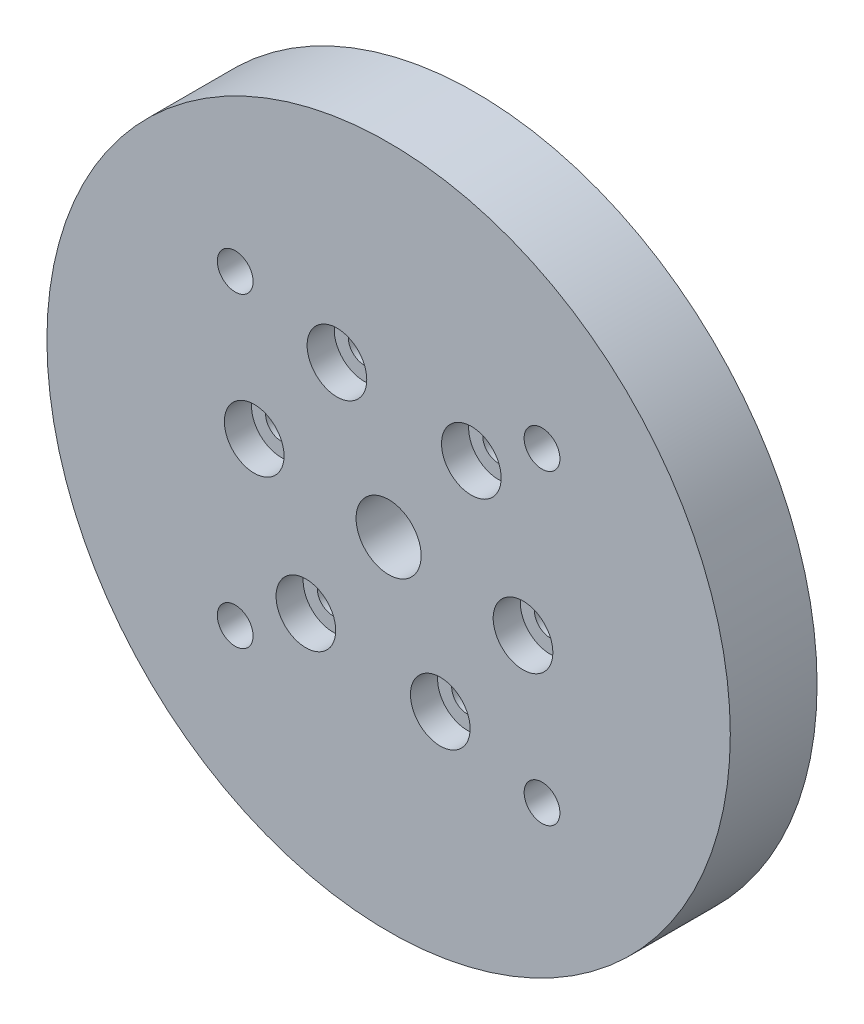
ISO-10303-21;
HEADER;
FILE_DESCRIPTION(('STEP AP214'),'2;1');
FILE_NAME('part.step','',(''),(''),'','','');
FILE_SCHEMA(('AUTOMOTIVE_DESIGN { 1 0 10303 214 1 1 1 1 }'));
ENDSEC;
DATA;
#1=APPLICATION_CONTEXT('core data for automotive mechanical design processes');
#2=APPLICATION_PROTOCOL_DEFINITION('international standard','automotive_design',2000,#1);
#3=PRODUCT_CONTEXT('',#1,'mechanical');
#4=PRODUCT('Part','Part','',(#3));
#5=PRODUCT_RELATED_PRODUCT_CATEGORY('part','',(#4));
#6=PRODUCT_DEFINITION_FORMATION('','',#4);
#7=PRODUCT_DEFINITION_CONTEXT('part definition',#1,'design');
#8=PRODUCT_DEFINITION('design','',#6,#7);
#9=PRODUCT_DEFINITION_SHAPE('','',#8);
#10=(LENGTH_UNIT() NAMED_UNIT(*) SI_UNIT(.MILLI.,.METRE.));
#11=(NAMED_UNIT(*) PLANE_ANGLE_UNIT() SI_UNIT($,.RADIAN.));
#12=(NAMED_UNIT(*) SI_UNIT($,.STERADIAN.) SOLID_ANGLE_UNIT());
#13=UNCERTAINTY_MEASURE_WITH_UNIT(LENGTH_MEASURE(1.E-05),#10,'distance_accuracy_value','');
#14=(GEOMETRIC_REPRESENTATION_CONTEXT(3) GLOBAL_UNCERTAINTY_ASSIGNED_CONTEXT((#13)) GLOBAL_UNIT_ASSIGNED_CONTEXT((#10,
#11,#12)) REPRESENTATION_CONTEXT('',''));
#15=CARTESIAN_POINT('',(0.,0.,0.));
#16=DIRECTION('',(0.,0.,1.));
#17=DIRECTION('',(1.,0.,0.));
#18=AXIS2_PLACEMENT_3D('',#15,#16,#17);
#19=CARTESIAN_POINT('',(7.62681454876585,9.90362054193988,575.));
#20=DIRECTION('',(0.,0.,-1.));
#21=DIRECTION('',(-1.,0.,0.));
#22=AXIS2_PLACEMENT_3D('',#19,#20,#21);
#23=CYLINDRICAL_SURFACE('',#22,1.45);
#24=CARTESIAN_POINT('',(7.62681454876585,9.90362054193988,567.));
#25=DIRECTION('',(0.,0.,1.));
#26=DIRECTION('',(1.,0.,0.));
#27=AXIS2_PLACEMENT_3D('',#24,#25,#26);
#28=CIRCLE('',#27,1.45);
#29=CARTESIAN_POINT('',(9.07681454876585,9.90362054193988,567.));
#30=VERTEX_POINT('',#29);
#31=EDGE_CURVE('E110',#30,#30,#28,.T.);
#32=ORIENTED_EDGE('',*,*,#31,.F.);
#33=EDGE_LOOP('',(#32));
#34=FACE_BOUND('',#33,.T.);
#35=CARTESIAN_POINT('',(7.62681454876585,9.90362054193988,572.5));
#36=DIRECTION('',(0.,0.,1.));
#37=DIRECTION('',(1.,0.,0.));
#38=AXIS2_PLACEMENT_3D('',#35,#36,#37);
#39=CIRCLE('',#38,1.45);
#40=CARTESIAN_POINT('',(9.07681454876585,9.90362054193988,572.5));
#41=VERTEX_POINT('',#40);
#42=EDGE_CURVE('E44',#41,#41,#39,.T.);
#43=ORIENTED_EDGE('',*,*,#42,.T.);
#44=EDGE_LOOP('',(#43));
#45=FACE_BOUND('',#44,.T.);
#46=ADVANCED_FACE('F41',(#34,#45),#23,.F.);
#47=CARTESIAN_POINT('',(-4.76337970437843,11.5568254201539,575.));
#48=DIRECTION('',(0.,0.,-1.));
#49=DIRECTION('',(-1.,0.,0.));
#50=AXIS2_PLACEMENT_3D('',#47,#48,#49);
#51=CYLINDRICAL_SURFACE('',#50,1.45);
#52=CARTESIAN_POINT('',(-4.76337970437843,11.5568254201539,567.));
#53=DIRECTION('',(0.,0.,1.));
#54=DIRECTION('',(1.,0.,0.));
#55=AXIS2_PLACEMENT_3D('',#52,#53,#54);
#56=CIRCLE('',#55,1.45);
#57=CARTESIAN_POINT('',(-3.31337970437843,11.5568254201539,567.));
#58=VERTEX_POINT('',#57);
#59=EDGE_CURVE('E111',#58,#58,#56,.T.);
#60=ORIENTED_EDGE('',*,*,#59,.F.);
#61=EDGE_LOOP('',(#60));
#62=FACE_BOUND('',#61,.T.);
#63=CARTESIAN_POINT('',(-4.76337970437843,11.5568254201539,572.5));
#64=DIRECTION('',(0.,0.,1.));
#65=DIRECTION('',(1.,0.,0.));
#66=AXIS2_PLACEMENT_3D('',#63,#64,#65);
#67=CIRCLE('',#66,1.45);
#68=CARTESIAN_POINT('',(-3.31337970437843,11.5568254201539,572.5));
#69=VERTEX_POINT('',#68);
#70=EDGE_CURVE('E79',#69,#69,#67,.T.);
#71=ORIENTED_EDGE('',*,*,#70,.T.);
#72=EDGE_LOOP('',(#71));
#73=FACE_BOUND('',#72,.T.);
#74=ADVANCED_FACE('F174',(#62,#73),#51,.F.);
#75=CARTESIAN_POINT('',(-12.3901942531443,1.65320487821403,575.));
#76=DIRECTION('',(0.,0.,-1.));
#77=DIRECTION('',(-1.,0.,0.));
#78=AXIS2_PLACEMENT_3D('',#75,#76,#77);
#79=CYLINDRICAL_SURFACE('',#78,1.45);
#80=CARTESIAN_POINT('',(-12.3901942531443,1.65320487821403,567.));
#81=DIRECTION('',(0.,0.,1.));
#82=DIRECTION('',(1.,0.,0.));
#83=AXIS2_PLACEMENT_3D('',#80,#81,#82);
#84=CIRCLE('',#83,1.45);
#85=CARTESIAN_POINT('',(-10.9401942531443,1.65320487821403,567.));
#86=VERTEX_POINT('',#85);
#87=EDGE_CURVE('E103',#86,#86,#84,.T.);
#88=ORIENTED_EDGE('',*,*,#87,.F.);
#89=EDGE_LOOP('',(#88));
#90=FACE_BOUND('',#89,.T.);
#91=CARTESIAN_POINT('',(-12.3901942531443,1.65320487821403,572.5));
#92=DIRECTION('',(0.,0.,1.));
#93=DIRECTION('',(1.,0.,0.));
#94=AXIS2_PLACEMENT_3D('',#91,#92,#93);
#95=CIRCLE('',#94,1.45);
#96=CARTESIAN_POINT('',(-10.9401942531443,1.65320487821403,572.5));
#97=VERTEX_POINT('',#96);
#98=EDGE_CURVE('E77',#97,#97,#95,.T.);
#99=ORIENTED_EDGE('',*,*,#98,.T.);
#100=EDGE_LOOP('',(#99));
#101=FACE_BOUND('',#100,.T.);
#102=ADVANCED_FACE('F179',(#90,#101),#79,.F.);
#103=CARTESIAN_POINT('',(-7.62681454876585,-9.90362054193988,575.));
#104=DIRECTION('',(0.,0.,-1.));
#105=DIRECTION('',(-1.,0.,0.));
#106=AXIS2_PLACEMENT_3D('',#103,#104,#105);
#107=CYLINDRICAL_SURFACE('',#106,1.45);
#108=CARTESIAN_POINT('',(-7.62681454876585,-9.90362054193988,567.));
#109=DIRECTION('',(0.,0.,1.));
#110=DIRECTION('',(1.,0.,0.));
#111=AXIS2_PLACEMENT_3D('',#108,#109,#110);
#112=CIRCLE('',#111,1.45);
#113=CARTESIAN_POINT('',(-6.17681454876585,-9.90362054193988,567.));
#114=VERTEX_POINT('',#113);
#115=EDGE_CURVE('E93',#114,#114,#112,.T.);
#116=ORIENTED_EDGE('',*,*,#115,.F.);
#117=EDGE_LOOP('',(#116));
#118=FACE_BOUND('',#117,.T.);
#119=CARTESIAN_POINT('',(-7.62681454876585,-9.90362054193988,572.5));
#120=DIRECTION('',(0.,0.,1.));
#121=DIRECTION('',(1.,0.,0.));
#122=AXIS2_PLACEMENT_3D('',#119,#120,#121);
#123=CIRCLE('',#122,1.45);
#124=CARTESIAN_POINT('',(-6.17681454876585,-9.90362054193988,572.5));
#125=VERTEX_POINT('',#124);
#126=EDGE_CURVE('E75',#125,#125,#123,.T.);
#127=ORIENTED_EDGE('',*,*,#126,.T.);
#128=EDGE_LOOP('',(#127));
#129=FACE_BOUND('',#128,.T.);
#130=ADVANCED_FACE('F188',(#118,#129),#107,.F.);
#131=CARTESIAN_POINT('',(4.76337970437842,-11.5568254201539,575.));
#132=DIRECTION('',(0.,0.,-1.));
#133=DIRECTION('',(-1.,0.,0.));
#134=AXIS2_PLACEMENT_3D('',#131,#132,#133);
#135=CYLINDRICAL_SURFACE('',#134,1.45);
#136=CARTESIAN_POINT('',(4.76337970437842,-11.5568254201539,567.));
#137=DIRECTION('',(0.,0.,1.));
#138=DIRECTION('',(1.,0.,0.));
#139=AXIS2_PLACEMENT_3D('',#136,#137,#138);
#140=CIRCLE('',#139,1.45);
#141=CARTESIAN_POINT('',(6.21337970437842,-11.5568254201539,567.));
#142=VERTEX_POINT('',#141);
#143=EDGE_CURVE('E87',#142,#142,#140,.T.);
#144=ORIENTED_EDGE('',*,*,#143,.F.);
#145=EDGE_LOOP('',(#144));
#146=FACE_BOUND('',#145,.T.);
#147=CARTESIAN_POINT('',(4.76337970437842,-11.5568254201539,572.5));
#148=DIRECTION('',(0.,0.,1.));
#149=DIRECTION('',(1.,0.,0.));
#150=AXIS2_PLACEMENT_3D('',#147,#148,#149);
#151=CIRCLE('',#150,1.45);
#152=CARTESIAN_POINT('',(6.21337970437842,-11.5568254201539,572.5));
#153=VERTEX_POINT('',#152);
#154=EDGE_CURVE('E69',#153,#153,#151,.T.);
#155=ORIENTED_EDGE('',*,*,#154,.T.);
#156=EDGE_LOOP('',(#155));
#157=FACE_BOUND('',#156,.T.);
#158=ADVANCED_FACE('F184',(#146,#157),#135,.F.);
#159=CARTESIAN_POINT('',(12.3901942531443,-1.65320487821403,575.));
#160=DIRECTION('',(0.,0.,-1.));
#161=DIRECTION('',(-1.,0.,0.));
#162=AXIS2_PLACEMENT_3D('',#159,#160,#161);
#163=CYLINDRICAL_SURFACE('',#162,1.45);
#164=CARTESIAN_POINT('',(12.3901942531443,-1.65320487821403,567.));
#165=DIRECTION('',(0.,0.,1.));
#166=DIRECTION('',(1.,0.,0.));
#167=AXIS2_PLACEMENT_3D('',#164,#165,#166);
#168=CIRCLE('',#167,1.45);
#169=CARTESIAN_POINT('',(13.8401942531443,-1.65320487821403,567.));
#170=VERTEX_POINT('',#169);
#171=EDGE_CURVE('E102',#170,#170,#168,.T.);
#172=ORIENTED_EDGE('',*,*,#171,.F.);
#173=EDGE_LOOP('',(#172));
#174=FACE_BOUND('',#173,.T.);
#175=CARTESIAN_POINT('',(12.3901942531443,-1.65320487821403,572.5));
#176=DIRECTION('',(0.,0.,1.));
#177=DIRECTION('',(1.,0.,0.));
#178=AXIS2_PLACEMENT_3D('',#175,#176,#177);
#179=CIRCLE('',#178,1.45);
#180=CARTESIAN_POINT('',(13.8401942531443,-1.65320487821403,572.5));
#181=VERTEX_POINT('',#180);
#182=EDGE_CURVE('E64',#181,#181,#179,.T.);
#183=ORIENTED_EDGE('',*,*,#182,.T.);
#184=EDGE_LOOP('',(#183));
#185=FACE_BOUND('',#184,.T.);
#186=ADVANCED_FACE('F236',(#174,#185),#163,.F.);
#187=CARTESIAN_POINT('',(0.,0.,575.));
#188=DIRECTION('',(0.,0.,-1.));
#189=DIRECTION('',(-1.,0.,0.));
#190=AXIS2_PLACEMENT_3D('',#187,#188,#189);
#191=CYLINDRICAL_SURFACE('',#190,31.5);
#192=CARTESIAN_POINT('',(0.,0.,575.));
#193=DIRECTION('',(0.,0.,1.));
#194=DIRECTION('',(1.,0.,0.));
#195=AXIS2_PLACEMENT_3D('',#192,#193,#194);
#196=CIRCLE('',#195,31.5);
#197=CARTESIAN_POINT('',(31.5,0.,575.));
#198=VERTEX_POINT('',#197);
#199=EDGE_CURVE('E10',#198,#198,#196,.T.);
#200=ORIENTED_EDGE('',*,*,#199,.F.);
#201=EDGE_LOOP('',(#200));
#202=FACE_BOUND('',#201,.T.);
#203=CARTESIAN_POINT('',(0.,0.,567.));
#204=DIRECTION('',(0.,0.,1.));
#205=DIRECTION('',(1.,0.,0.));
#206=AXIS2_PLACEMENT_3D('',#203,#204,#205);
#207=CIRCLE('',#206,31.5);
#208=CARTESIAN_POINT('',(31.5,0.,567.));
#209=VERTEX_POINT('',#208);
#210=EDGE_CURVE('E49',#209,#209,#207,.T.);
#211=ORIENTED_EDGE('',*,*,#210,.T.);
#212=EDGE_LOOP('',(#211));
#213=FACE_BOUND('',#212,.T.);
#214=ADVANCED_FACE('F43',(#202,#213),#191,.T.);
#215=CARTESIAN_POINT('',(0.,0.,575.));
#216=DIRECTION('',(0.,0.,1.));
#217=DIRECTION('',(1.,0.,0.));
#218=AXIS2_PLACEMENT_3D('',#215,#216,#217);
#219=PLANE('',#218);
#220=CARTESIAN_POINT('',(7.62681454876585,9.90362054193988,575.));
#221=DIRECTION('',(0.,0.,1.));
#222=DIRECTION('',(1.,0.,0.));
#223=AXIS2_PLACEMENT_3D('',#220,#221,#222);
#224=CIRCLE('',#223,2.75);
#225=CARTESIAN_POINT('',(10.3768145487658,9.90362054193988,575.));
#226=VERTEX_POINT('',#225);
#227=EDGE_CURVE('E241',#226,#226,#224,.T.);
#228=ORIENTED_EDGE('',*,*,#227,.F.);
#229=EDGE_LOOP('',(#228));
#230=FACE_BOUND('',#229,.T.);
#231=CARTESIAN_POINT('',(-4.76337970437843,11.5568254201539,575.));
#232=DIRECTION('',(0.,0.,1.));
#233=DIRECTION('',(1.,0.,0.));
#234=AXIS2_PLACEMENT_3D('',#231,#232,#233);
#235=CIRCLE('',#234,2.75);
#236=CARTESIAN_POINT('',(-2.01337970437843,11.5568254201539,575.));
#237=VERTEX_POINT('',#236);
#238=EDGE_CURVE('E244',#237,#237,#235,.T.);
#239=ORIENTED_EDGE('',*,*,#238,.F.);
#240=EDGE_LOOP('',(#239));
#241=FACE_BOUND('',#240,.T.);
#242=CARTESIAN_POINT('',(-12.3901942531443,1.65320487821403,575.));
#243=DIRECTION('',(0.,0.,1.));
#244=DIRECTION('',(1.,0.,0.));
#245=AXIS2_PLACEMENT_3D('',#242,#243,#244);
#246=CIRCLE('',#245,2.75);
#247=CARTESIAN_POINT('',(-9.64019425314427,1.65320487821403,575.));
#248=VERTEX_POINT('',#247);
#249=EDGE_CURVE('E248',#248,#248,#246,.T.);
#250=ORIENTED_EDGE('',*,*,#249,.F.);
#251=EDGE_LOOP('',(#250));
#252=FACE_BOUND('',#251,.T.);
#253=CARTESIAN_POINT('',(-7.62681454876585,-9.90362054193988,575.));
#254=DIRECTION('',(0.,0.,1.));
#255=DIRECTION('',(1.,0.,0.));
#256=AXIS2_PLACEMENT_3D('',#253,#254,#255);
#257=CIRCLE('',#256,2.75);
#258=CARTESIAN_POINT('',(-4.87681454876585,-9.90362054193988,575.));
#259=VERTEX_POINT('',#258);
#260=EDGE_CURVE('E254',#259,#259,#257,.T.);
#261=ORIENTED_EDGE('',*,*,#260,.F.);
#262=EDGE_LOOP('',(#261));
#263=FACE_BOUND('',#262,.T.);
#264=CARTESIAN_POINT('',(4.76337970437842,-11.5568254201539,575.));
#265=DIRECTION('',(0.,0.,1.));
#266=DIRECTION('',(1.,0.,0.));
#267=AXIS2_PLACEMENT_3D('',#264,#265,#266);
#268=CIRCLE('',#267,2.75);
#269=CARTESIAN_POINT('',(7.51337970437842,-11.5568254201539,575.));
#270=VERTEX_POINT('',#269);
#271=EDGE_CURVE('E260',#270,#270,#268,.T.);
#272=ORIENTED_EDGE('',*,*,#271,.F.);
#273=EDGE_LOOP('',(#272));
#274=FACE_BOUND('',#273,.T.);
#275=CARTESIAN_POINT('',(12.3901942531443,-1.65320487821403,575.));
#276=DIRECTION('',(0.,0.,1.));
#277=DIRECTION('',(1.,0.,0.));
#278=AXIS2_PLACEMENT_3D('',#275,#276,#277);
#279=CIRCLE('',#278,2.75);
#280=CARTESIAN_POINT('',(15.1401942531443,-1.65320487821403,575.));
#281=VERTEX_POINT('',#280);
#282=EDGE_CURVE('E67',#281,#281,#279,.T.);
#283=ORIENTED_EDGE('',*,*,#282,.F.);
#284=EDGE_LOOP('',(#283));
#285=FACE_BOUND('',#284,.T.);
#286=CARTESIAN_POINT('',(14.1421356237309,-14.142135623731,575.));
#287=DIRECTION('',(0.,0.,1.));
#288=DIRECTION('',(1.,0.,0.));
#289=AXIS2_PLACEMENT_3D('',#286,#287,#288);
#290=CIRCLE('',#289,1.65);
#291=CARTESIAN_POINT('',(15.7921356237309,-14.142135623731,575.));
#292=VERTEX_POINT('',#291);
#293=EDGE_CURVE('E138',#292,#292,#290,.T.);
#294=ORIENTED_EDGE('',*,*,#293,.F.);
#295=EDGE_LOOP('',(#294));
#296=FACE_BOUND('',#295,.T.);
#297=CARTESIAN_POINT('',(-14.142135623731,-14.1421356237309,575.));
#298=DIRECTION('',(0.,0.,1.));
#299=DIRECTION('',(1.,0.,0.));
#300=AXIS2_PLACEMENT_3D('',#297,#298,#299);
#301=CIRCLE('',#300,1.65);
#302=CARTESIAN_POINT('',(-12.492135623731,-14.1421356237309,575.));
#303=VERTEX_POINT('',#302);
#304=EDGE_CURVE('E133',#303,#303,#301,.T.);
#305=ORIENTED_EDGE('',*,*,#304,.F.);
#306=EDGE_LOOP('',(#305));
#307=FACE_BOUND('',#306,.T.);
#308=CARTESIAN_POINT('',(-14.1421356237309,14.142135623731,575.));
#309=DIRECTION('',(0.,0.,1.));
#310=DIRECTION('',(1.,0.,0.));
#311=AXIS2_PLACEMENT_3D('',#308,#309,#310);
#312=CIRCLE('',#311,1.65);
#313=CARTESIAN_POINT('',(-12.4921356237309,14.142135623731,575.));
#314=VERTEX_POINT('',#313);
#315=EDGE_CURVE('E124',#314,#314,#312,.T.);
#316=ORIENTED_EDGE('',*,*,#315,.F.);
#317=EDGE_LOOP('',(#316));
#318=FACE_BOUND('',#317,.T.);
#319=CARTESIAN_POINT('',(14.142135623731,14.142135623731,575.));
#320=DIRECTION('',(0.,0.,1.));
#321=DIRECTION('',(1.,0.,0.));
#322=AXIS2_PLACEMENT_3D('',#319,#320,#321);
#323=CIRCLE('',#322,1.65);
#324=CARTESIAN_POINT('',(15.792135623731,14.142135623731,575.));
#325=VERTEX_POINT('',#324);
#326=EDGE_CURVE('E141',#325,#325,#323,.T.);
#327=ORIENTED_EDGE('',*,*,#326,.F.);
#328=EDGE_LOOP('',(#327));
#329=FACE_BOUND('',#328,.T.);
#330=CARTESIAN_POINT('',(0.,0.,575.));
#331=DIRECTION('',(0.,0.,1.));
#332=DIRECTION('',(1.,0.,0.));
#333=AXIS2_PLACEMENT_3D('',#330,#331,#332);
#334=CIRCLE('',#333,3.);
#335=CARTESIAN_POINT('',(3.,0.,575.));
#336=VERTEX_POINT('',#335);
#337=EDGE_CURVE('E60',#336,#336,#334,.T.);
#338=ORIENTED_EDGE('',*,*,#337,.F.);
#339=EDGE_LOOP('',(#338));
#340=FACE_BOUND('',#339,.T.);
#341=ORIENTED_EDGE('',*,*,#199,.T.);
#342=EDGE_LOOP('',(#341));
#343=FACE_BOUND('',#342,.T.);
#344=ADVANCED_FACE('F171',(#230,#241,#252,#263,#274,#285,#296,#307,#318,#329,#340,#343),#219,.T.);
#345=CARTESIAN_POINT('',(0.,0.,567.));
#346=DIRECTION('',(0.,0.,1.));
#347=DIRECTION('',(1.,0.,0.));
#348=AXIS2_PLACEMENT_3D('',#345,#346,#347);
#349=PLANE('',#348);
#350=ORIENTED_EDGE('',*,*,#171,.T.);
#351=EDGE_LOOP('',(#350));
#352=FACE_BOUND('',#351,.T.);
#353=ORIENTED_EDGE('',*,*,#143,.T.);
#354=EDGE_LOOP('',(#353));
#355=FACE_BOUND('',#354,.T.);
#356=ORIENTED_EDGE('',*,*,#115,.T.);
#357=EDGE_LOOP('',(#356));
#358=FACE_BOUND('',#357,.T.);
#359=ORIENTED_EDGE('',*,*,#87,.T.);
#360=EDGE_LOOP('',(#359));
#361=FACE_BOUND('',#360,.T.);
#362=ORIENTED_EDGE('',*,*,#59,.T.);
#363=EDGE_LOOP('',(#362));
#364=FACE_BOUND('',#363,.T.);
#365=ORIENTED_EDGE('',*,*,#31,.T.);
#366=EDGE_LOOP('',(#365));
#367=FACE_BOUND('',#366,.T.);
#368=CARTESIAN_POINT('',(14.1421356237309,-14.142135623731,567.));
#369=DIRECTION('',(0.,0.,1.));
#370=DIRECTION('',(1.,0.,0.));
#371=AXIS2_PLACEMENT_3D('',#368,#369,#370);
#372=CIRCLE('',#371,1.65);
#373=CARTESIAN_POINT('',(15.7921356237309,-14.142135623731,567.));
#374=VERTEX_POINT('',#373);
#375=EDGE_CURVE('E131',#374,#374,#372,.T.);
#376=ORIENTED_EDGE('',*,*,#375,.T.);
#377=EDGE_LOOP('',(#376));
#378=FACE_BOUND('',#377,.T.);
#379=CARTESIAN_POINT('',(-14.142135623731,-14.1421356237309,567.));
#380=DIRECTION('',(0.,0.,1.));
#381=DIRECTION('',(1.,0.,0.));
#382=AXIS2_PLACEMENT_3D('',#379,#380,#381);
#383=CIRCLE('',#382,1.65);
#384=CARTESIAN_POINT('',(-12.492135623731,-14.1421356237309,567.));
#385=VERTEX_POINT('',#384);
#386=EDGE_CURVE('E130',#385,#385,#383,.T.);
#387=ORIENTED_EDGE('',*,*,#386,.T.);
#388=EDGE_LOOP('',(#387));
#389=FACE_BOUND('',#388,.T.);
#390=CARTESIAN_POINT('',(-14.1421356237309,14.142135623731,567.));
#391=DIRECTION('',(0.,0.,1.));
#392=DIRECTION('',(1.,0.,0.));
#393=AXIS2_PLACEMENT_3D('',#390,#391,#392);
#394=CIRCLE('',#393,1.65);
#395=CARTESIAN_POINT('',(-12.4921356237309,14.142135623731,567.));
#396=VERTEX_POINT('',#395);
#397=EDGE_CURVE('E117',#396,#396,#394,.T.);
#398=ORIENTED_EDGE('',*,*,#397,.T.);
#399=EDGE_LOOP('',(#398));
#400=FACE_BOUND('',#399,.T.);
#401=CARTESIAN_POINT('',(14.142135623731,14.142135623731,567.));
#402=DIRECTION('',(0.,0.,1.));
#403=DIRECTION('',(1.,0.,0.));
#404=AXIS2_PLACEMENT_3D('',#401,#402,#403);
#405=CIRCLE('',#404,1.65);
#406=CARTESIAN_POINT('',(15.792135623731,14.142135623731,567.));
#407=VERTEX_POINT('',#406);
#408=EDGE_CURVE('E125',#407,#407,#405,.T.);
#409=ORIENTED_EDGE('',*,*,#408,.T.);
#410=EDGE_LOOP('',(#409));
#411=FACE_BOUND('',#410,.T.);
#412=CARTESIAN_POINT('',(0.,0.,567.));
#413=DIRECTION('',(0.,0.,1.));
#414=DIRECTION('',(1.,0.,0.));
#415=AXIS2_PLACEMENT_3D('',#412,#413,#414);
#416=CIRCLE('',#415,3.);
#417=CARTESIAN_POINT('',(3.,0.,567.));
#418=VERTEX_POINT('',#417);
#419=EDGE_CURVE('E58',#418,#418,#416,.T.);
#420=ORIENTED_EDGE('',*,*,#419,.T.);
#421=EDGE_LOOP('',(#420));
#422=FACE_BOUND('',#421,.T.);
#423=ORIENTED_EDGE('',*,*,#210,.F.);
#424=EDGE_LOOP('',(#423));
#425=FACE_BOUND('',#424,.T.);
#426=ADVANCED_FACE('F157',(#352,#355,#358,#361,#364,#367,#378,#389,#400,#411,#422,#425),#349,.F.);
#427=CARTESIAN_POINT('',(0.,0.,575.));
#428=DIRECTION('',(0.,0.,-1.));
#429=DIRECTION('',(-1.,0.,0.));
#430=AXIS2_PLACEMENT_3D('',#427,#428,#429);
#431=CYLINDRICAL_SURFACE('',#430,3.);
#432=ORIENTED_EDGE('',*,*,#337,.T.);
#433=EDGE_LOOP('',(#432));
#434=FACE_BOUND('',#433,.T.);
#435=ORIENTED_EDGE('',*,*,#419,.F.);
#436=EDGE_LOOP('',(#435));
#437=FACE_BOUND('',#436,.T.);
#438=ADVANCED_FACE('F163',(#434,#437),#431,.F.);
#439=CARTESIAN_POINT('',(14.142135623731,14.142135623731,575.));
#440=DIRECTION('',(0.,0.,-1.));
#441=DIRECTION('',(-1.,0.,0.));
#442=AXIS2_PLACEMENT_3D('',#439,#440,#441);
#443=CYLINDRICAL_SURFACE('',#442,1.65);
#444=ORIENTED_EDGE('',*,*,#326,.T.);
#445=EDGE_LOOP('',(#444));
#446=FACE_BOUND('',#445,.T.);
#447=ORIENTED_EDGE('',*,*,#408,.F.);
#448=EDGE_LOOP('',(#447));
#449=FACE_BOUND('',#448,.T.);
#450=ADVANCED_FACE('F161',(#446,#449),#443,.F.);
#451=CARTESIAN_POINT('',(-14.1421356237309,14.142135623731,575.));
#452=DIRECTION('',(0.,0.,-1.));
#453=DIRECTION('',(-1.,0.,0.));
#454=AXIS2_PLACEMENT_3D('',#451,#452,#453);
#455=CYLINDRICAL_SURFACE('',#454,1.65);
#456=ORIENTED_EDGE('',*,*,#315,.T.);
#457=EDGE_LOOP('',(#456));
#458=FACE_BOUND('',#457,.T.);
#459=ORIENTED_EDGE('',*,*,#397,.F.);
#460=EDGE_LOOP('',(#459));
#461=FACE_BOUND('',#460,.T.);
#462=ADVANCED_FACE('F166',(#458,#461),#455,.F.);
#463=CARTESIAN_POINT('',(-14.142135623731,-14.1421356237309,575.));
#464=DIRECTION('',(0.,0.,-1.));
#465=DIRECTION('',(-1.,0.,0.));
#466=AXIS2_PLACEMENT_3D('',#463,#464,#465);
#467=CYLINDRICAL_SURFACE('',#466,1.65);
#468=ORIENTED_EDGE('',*,*,#304,.T.);
#469=EDGE_LOOP('',(#468));
#470=FACE_BOUND('',#469,.T.);
#471=ORIENTED_EDGE('',*,*,#386,.F.);
#472=EDGE_LOOP('',(#471));
#473=FACE_BOUND('',#472,.T.);
#474=ADVANCED_FACE('F199',(#470,#473),#467,.F.);
#475=CARTESIAN_POINT('',(14.1421356237309,-14.142135623731,575.));
#476=DIRECTION('',(0.,0.,-1.));
#477=DIRECTION('',(-1.,0.,0.));
#478=AXIS2_PLACEMENT_3D('',#475,#476,#477);
#479=CYLINDRICAL_SURFACE('',#478,1.65);
#480=ORIENTED_EDGE('',*,*,#293,.T.);
#481=EDGE_LOOP('',(#480));
#482=FACE_BOUND('',#481,.T.);
#483=ORIENTED_EDGE('',*,*,#375,.F.);
#484=EDGE_LOOP('',(#483));
#485=FACE_BOUND('',#484,.T.);
#486=ADVANCED_FACE('F201',(#482,#485),#479,.F.);
#487=CARTESIAN_POINT('',(12.3901942531443,-1.65320487821403,575.));
#488=DIRECTION('',(0.,0.,-1.));
#489=DIRECTION('',(-1.,0.,0.));
#490=AXIS2_PLACEMENT_3D('',#487,#488,#489);
#491=CYLINDRICAL_SURFACE('',#490,2.75);
#492=ORIENTED_EDGE('',*,*,#282,.T.);
#493=EDGE_LOOP('',(#492));
#494=FACE_BOUND('',#493,.T.);
#495=CARTESIAN_POINT('',(12.3901942531443,-1.65320487821403,572.5));
#496=DIRECTION('',(0.,0.,1.));
#497=DIRECTION('',(1.,0.,0.));
#498=AXIS2_PLACEMENT_3D('',#495,#496,#497);
#499=CIRCLE('',#498,2.75);
#500=CARTESIAN_POINT('',(15.1401942531443,-1.65320487821403,572.5));
#501=VERTEX_POINT('',#500);
#502=EDGE_CURVE('E258',#501,#501,#499,.T.);
#503=ORIENTED_EDGE('',*,*,#502,.F.);
#504=EDGE_LOOP('',(#503));
#505=FACE_BOUND('',#504,.T.);
#506=ADVANCED_FACE('F203',(#494,#505),#491,.F.);
#507=CARTESIAN_POINT('',(12.3901942531443,-1.65320487821403,572.5));
#508=DIRECTION('',(0.,0.,1.));
#509=DIRECTION('',(1.,0.,0.));
#510=AXIS2_PLACEMENT_3D('',#507,#508,#509);
#511=PLANE('',#510);
#512=ORIENTED_EDGE('',*,*,#182,.F.);
#513=EDGE_LOOP('',(#512));
#514=FACE_BOUND('',#513,.T.);
#515=ORIENTED_EDGE('',*,*,#502,.T.);
#516=EDGE_LOOP('',(#515));
#517=FACE_BOUND('',#516,.T.);
#518=ADVANCED_FACE('F206',(#514,#517),#511,.T.);
#519=CARTESIAN_POINT('',(4.76337970437842,-11.5568254201539,575.));
#520=DIRECTION('',(0.,0.,-1.));
#521=DIRECTION('',(-1.,0.,0.));
#522=AXIS2_PLACEMENT_3D('',#519,#520,#521);
#523=CYLINDRICAL_SURFACE('',#522,2.75);
#524=ORIENTED_EDGE('',*,*,#271,.T.);
#525=EDGE_LOOP('',(#524));
#526=FACE_BOUND('',#525,.T.);
#527=CARTESIAN_POINT('',(4.76337970437842,-11.5568254201539,572.5));
#528=DIRECTION('',(0.,0.,1.));
#529=DIRECTION('',(1.,0.,0.));
#530=AXIS2_PLACEMENT_3D('',#527,#528,#529);
#531=CIRCLE('',#530,2.75);
#532=CARTESIAN_POINT('',(7.51337970437842,-11.5568254201539,572.5));
#533=VERTEX_POINT('',#532);
#534=EDGE_CURVE('E268',#533,#533,#531,.T.);
#535=ORIENTED_EDGE('',*,*,#534,.F.);
#536=EDGE_LOOP('',(#535));
#537=FACE_BOUND('',#536,.T.);
#538=ADVANCED_FACE('F291',(#526,#537),#523,.F.);
#539=CARTESIAN_POINT('',(4.76337970437842,-11.5568254201539,572.5));
#540=DIRECTION('',(0.,0.,1.));
#541=DIRECTION('',(1.,0.,0.));
#542=AXIS2_PLACEMENT_3D('',#539,#540,#541);
#543=PLANE('',#542);
#544=ORIENTED_EDGE('',*,*,#154,.F.);
#545=EDGE_LOOP('',(#544));
#546=FACE_BOUND('',#545,.T.);
#547=ORIENTED_EDGE('',*,*,#534,.T.);
#548=EDGE_LOOP('',(#547));
#549=FACE_BOUND('',#548,.T.);
#550=ADVANCED_FACE('F293',(#546,#549),#543,.T.);
#551=CARTESIAN_POINT('',(-7.62681454876585,-9.90362054193988,575.));
#552=DIRECTION('',(0.,0.,-1.));
#553=DIRECTION('',(-1.,0.,0.));
#554=AXIS2_PLACEMENT_3D('',#551,#552,#553);
#555=CYLINDRICAL_SURFACE('',#554,2.75);
#556=ORIENTED_EDGE('',*,*,#260,.T.);
#557=EDGE_LOOP('',(#556));
#558=FACE_BOUND('',#557,.T.);
#559=CARTESIAN_POINT('',(-7.62681454876585,-9.90362054193988,572.5));
#560=DIRECTION('',(0.,0.,1.));
#561=DIRECTION('',(1.,0.,0.));
#562=AXIS2_PLACEMENT_3D('',#559,#560,#561);
#563=CIRCLE('',#562,2.75);
#564=CARTESIAN_POINT('',(-4.87681454876585,-9.90362054193988,572.5));
#565=VERTEX_POINT('',#564);
#566=EDGE_CURVE('E267',#565,#565,#563,.T.);
#567=ORIENTED_EDGE('',*,*,#566,.F.);
#568=EDGE_LOOP('',(#567));
#569=FACE_BOUND('',#568,.T.);
#570=ADVANCED_FACE('F297',(#558,#569),#555,.F.);
#571=CARTESIAN_POINT('',(-7.62681454876585,-9.90362054193988,572.5));
#572=DIRECTION('',(0.,0.,1.));
#573=DIRECTION('',(1.,0.,0.));
#574=AXIS2_PLACEMENT_3D('',#571,#572,#573);
#575=PLANE('',#574);
#576=ORIENTED_EDGE('',*,*,#126,.F.);
#577=EDGE_LOOP('',(#576));
#578=FACE_BOUND('',#577,.T.);
#579=ORIENTED_EDGE('',*,*,#566,.T.);
#580=EDGE_LOOP('',(#579));
#581=FACE_BOUND('',#580,.T.);
#582=ADVANCED_FACE('F328',(#578,#581),#575,.T.);
#583=CARTESIAN_POINT('',(-12.3901942531443,1.65320487821403,575.));
#584=DIRECTION('',(0.,0.,-1.));
#585=DIRECTION('',(-1.,0.,0.));
#586=AXIS2_PLACEMENT_3D('',#583,#584,#585);
#587=CYLINDRICAL_SURFACE('',#586,2.75);
#588=ORIENTED_EDGE('',*,*,#249,.T.);
#589=EDGE_LOOP('',(#588));
#590=FACE_BOUND('',#589,.T.);
#591=CARTESIAN_POINT('',(-12.3901942531443,1.65320487821403,572.5));
#592=DIRECTION('',(0.,0.,1.));
#593=DIRECTION('',(1.,0.,0.));
#594=AXIS2_PLACEMENT_3D('',#591,#592,#593);
#595=CIRCLE('',#594,2.75);
#596=CARTESIAN_POINT('',(-9.64019425314427,1.65320487821403,572.5));
#597=VERTEX_POINT('',#596);
#598=EDGE_CURVE('E273',#597,#597,#595,.T.);
#599=ORIENTED_EDGE('',*,*,#598,.F.);
#600=EDGE_LOOP('',(#599));
#601=FACE_BOUND('',#600,.T.);
#602=ADVANCED_FACE('F324',(#590,#601),#587,.F.);
#603=CARTESIAN_POINT('',(-12.3901942531443,1.65320487821403,572.5));
#604=DIRECTION('',(0.,0.,1.));
#605=DIRECTION('',(1.,0.,0.));
#606=AXIS2_PLACEMENT_3D('',#603,#604,#605);
#607=PLANE('',#606);
#608=ORIENTED_EDGE('',*,*,#98,.F.);
#609=EDGE_LOOP('',(#608));
#610=FACE_BOUND('',#609,.T.);
#611=ORIENTED_EDGE('',*,*,#598,.T.);
#612=EDGE_LOOP('',(#611));
#613=FACE_BOUND('',#612,.T.);
#614=ADVANCED_FACE('F319',(#610,#613),#607,.T.);
#615=CARTESIAN_POINT('',(-4.76337970437843,11.5568254201539,575.));
#616=DIRECTION('',(0.,0.,-1.));
#617=DIRECTION('',(-1.,0.,0.));
#618=AXIS2_PLACEMENT_3D('',#615,#616,#617);
#619=CYLINDRICAL_SURFACE('',#618,2.75);
#620=ORIENTED_EDGE('',*,*,#238,.T.);
#621=EDGE_LOOP('',(#620));
#622=FACE_BOUND('',#621,.T.);
#623=CARTESIAN_POINT('',(-4.76337970437843,11.5568254201539,572.5));
#624=DIRECTION('',(0.,0.,1.));
#625=DIRECTION('',(1.,0.,0.));
#626=AXIS2_PLACEMENT_3D('',#623,#624,#625);
#627=CIRCLE('',#626,2.75);
#628=CARTESIAN_POINT('',(-2.01337970437843,11.5568254201539,572.5));
#629=VERTEX_POINT('',#628);
#630=EDGE_CURVE('E276',#629,#629,#627,.T.);
#631=ORIENTED_EDGE('',*,*,#630,.F.);
#632=EDGE_LOOP('',(#631));
#633=FACE_BOUND('',#632,.T.);
#634=ADVANCED_FACE('F314',(#622,#633),#619,.F.);
#635=CARTESIAN_POINT('',(-4.76337970437843,11.5568254201539,572.5));
#636=DIRECTION('',(0.,0.,1.));
#637=DIRECTION('',(1.,0.,0.));
#638=AXIS2_PLACEMENT_3D('',#635,#636,#637);
#639=PLANE('',#638);
#640=ORIENTED_EDGE('',*,*,#70,.F.);
#641=EDGE_LOOP('',(#640));
#642=FACE_BOUND('',#641,.T.);
#643=ORIENTED_EDGE('',*,*,#630,.T.);
#644=EDGE_LOOP('',(#643));
#645=FACE_BOUND('',#644,.T.);
#646=ADVANCED_FACE('F309',(#642,#645),#639,.T.);
#647=CARTESIAN_POINT('',(7.62681454876585,9.90362054193988,575.));
#648=DIRECTION('',(0.,0.,-1.));
#649=DIRECTION('',(-1.,0.,0.));
#650=AXIS2_PLACEMENT_3D('',#647,#648,#649);
#651=CYLINDRICAL_SURFACE('',#650,2.75);
#652=ORIENTED_EDGE('',*,*,#227,.T.);
#653=EDGE_LOOP('',(#652));
#654=FACE_BOUND('',#653,.T.);
#655=CARTESIAN_POINT('',(7.62681454876585,9.90362054193988,572.5));
#656=DIRECTION('',(0.,0.,1.));
#657=DIRECTION('',(1.,0.,0.));
#658=AXIS2_PLACEMENT_3D('',#655,#656,#657);
#659=CIRCLE('',#658,2.75);
#660=CARTESIAN_POINT('',(10.3768145487658,9.90362054193988,572.5));
#661=VERTEX_POINT('',#660);
#662=EDGE_CURVE('E265',#661,#661,#659,.T.);
#663=ORIENTED_EDGE('',*,*,#662,.F.);
#664=EDGE_LOOP('',(#663));
#665=FACE_BOUND('',#664,.T.);
#666=ADVANCED_FACE('F306',(#654,#665),#651,.F.);
#667=CARTESIAN_POINT('',(7.62681454876585,9.90362054193988,572.5));
#668=DIRECTION('',(0.,0.,1.));
#669=DIRECTION('',(1.,0.,0.));
#670=AXIS2_PLACEMENT_3D('',#667,#668,#669);
#671=PLANE('',#670);
#672=ORIENTED_EDGE('',*,*,#42,.F.);
#673=EDGE_LOOP('',(#672));
#674=FACE_BOUND('',#673,.T.);
#675=ORIENTED_EDGE('',*,*,#662,.T.);
#676=EDGE_LOOP('',(#675));
#677=FACE_BOUND('',#676,.T.);
#678=ADVANCED_FACE('F307',(#674,#677),#671,.T.);
#679=CLOSED_SHELL('',(#46,#74,#102,#130,#158,#186,#214,#344,#426,#438,#450,#462,#474,#486,#506,
#518,#538,#550,#570,#582,#602,#614,#634,#646,#666,#678));
#680=MANIFOLD_SOLID_BREP('B2',#679);
#681=ADVANCED_BREP_SHAPE_REPRESENTATION('',(#18,#680),#14);
#682=SHAPE_DEFINITION_REPRESENTATION(#9,#681);
ENDSEC;
END-ISO-10303-21;
